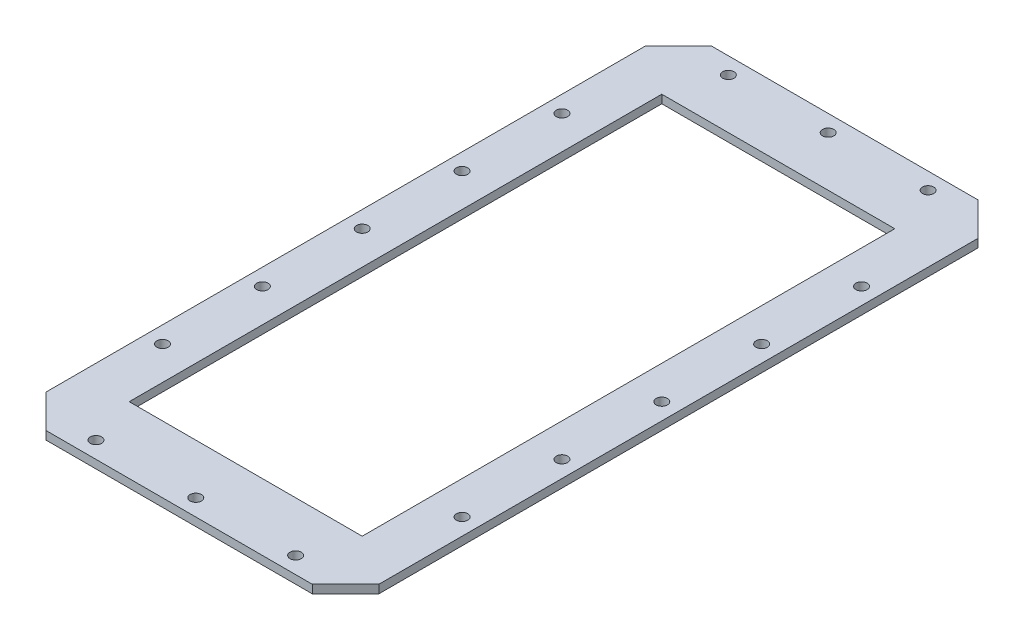
ISO-10303-21;
HEADER;
FILE_DESCRIPTION(('STEP AP214'),'2;1');
FILE_NAME('part.step','',(''),(''),'','','');
FILE_SCHEMA(('AUTOMOTIVE_DESIGN { 1 0 10303 214 1 1 1 1 }'));
ENDSEC;
DATA;
#1=APPLICATION_CONTEXT('core data for automotive mechanical design processes');
#2=APPLICATION_PROTOCOL_DEFINITION('international standard','automotive_design',2000,#1);
#3=PRODUCT_CONTEXT('',#1,'mechanical');
#4=PRODUCT('Part','Part','',(#3));
#5=PRODUCT_RELATED_PRODUCT_CATEGORY('part','',(#4));
#6=PRODUCT_DEFINITION_FORMATION('','',#4);
#7=PRODUCT_DEFINITION_CONTEXT('part definition',#1,'design');
#8=PRODUCT_DEFINITION('design','',#6,#7);
#9=PRODUCT_DEFINITION_SHAPE('','',#8);
#10=(LENGTH_UNIT() NAMED_UNIT(*) SI_UNIT(.MILLI.,.METRE.));
#11=(NAMED_UNIT(*) PLANE_ANGLE_UNIT() SI_UNIT($,.RADIAN.));
#12=(NAMED_UNIT(*) SI_UNIT($,.STERADIAN.) SOLID_ANGLE_UNIT());
#13=UNCERTAINTY_MEASURE_WITH_UNIT(LENGTH_MEASURE(1.E-05),#10,'distance_accuracy_value','');
#14=(GEOMETRIC_REPRESENTATION_CONTEXT(3) GLOBAL_UNCERTAINTY_ASSIGNED_CONTEXT((#13)) GLOBAL_UNIT_ASSIGNED_CONTEXT((#10,
#11,#12)) REPRESENTATION_CONTEXT('',''));
#15=CARTESIAN_POINT('',(0.,0.,0.));
#16=DIRECTION('',(0.,0.,1.));
#17=DIRECTION('',(1.,0.,0.));
#18=AXIS2_PLACEMENT_3D('',#15,#16,#17);
#19=CARTESIAN_POINT('',(0.,3.175,-228.6));
#20=DIRECTION('',(0.,0.,-1.));
#21=DIRECTION('',(-1.,0.,0.));
#22=AXIS2_PLACEMENT_3D('',#19,#20,#21);
#23=PLANE('',#22);
#24=DIRECTION('',(1.,0.,0.));
#25=VECTOR('',#24,1.);
#26=CARTESIAN_POINT('',(0.,0.,-228.6));
#27=LINE('',#26,#25);
#28=CARTESIAN_POINT('',(19.0499999999998,0.,-228.6));
#29=VERTEX_POINT('',#28);
#30=CARTESIAN_POINT('',(107.949999999999,0.,-228.6));
#31=VERTEX_POINT('',#30);
#32=EDGE_CURVE('E228',#29,#31,#27,.T.);
#33=ORIENTED_EDGE('',*,*,#32,.T.);
#34=DIRECTION('',(0.,-1.,0.));
#35=VECTOR('',#34,1.);
#36=CARTESIAN_POINT('',(107.949999999999,3.175,-228.6));
#37=LINE('',#36,#35);
#38=CARTESIAN_POINT('',(107.949999999999,3.175,-228.6));
#39=VERTEX_POINT('',#38);
#40=EDGE_CURVE('E11',#39,#31,#37,.T.);
#41=ORIENTED_EDGE('',*,*,#40,.F.);
#42=DIRECTION('',(1.,0.,0.));
#43=VECTOR('',#42,1.);
#44=CARTESIAN_POINT('',(0.,3.175,-228.6));
#45=LINE('',#44,#43);
#46=CARTESIAN_POINT('',(19.0499999999998,3.175,-228.6));
#47=VERTEX_POINT('',#46);
#48=EDGE_CURVE('E139',#47,#39,#45,.T.);
#49=ORIENTED_EDGE('',*,*,#48,.F.);
#50=DIRECTION('',(0.,-1.,0.));
#51=VECTOR('',#50,1.);
#52=CARTESIAN_POINT('',(19.0499999999998,3.175,-228.6));
#53=LINE('',#52,#51);
#54=EDGE_CURVE('E54',#47,#29,#53,.T.);
#55=ORIENTED_EDGE('',*,*,#54,.T.);
#56=EDGE_LOOP('',(#33,#41,#49,#55));
#57=FACE_BOUND('',#56,.T.);
#58=ADVANCED_FACE('F35',(#57),#23,.F.);
#59=CARTESIAN_POINT('',(107.949999999999,3.175,0.));
#60=DIRECTION('',(1.,0.,0.));
#61=DIRECTION('',(0.,0.,-1.));
#62=AXIS2_PLACEMENT_3D('',#59,#60,#61);
#63=PLANE('',#62);
#64=DIRECTION('',(0.,0.,1.));
#65=VECTOR('',#64,1.);
#66=CARTESIAN_POINT('',(107.949999999999,0.,0.));
#67=LINE('',#66,#65);
#68=CARTESIAN_POINT('',(107.949999999999,0.,-25.4000000000005));
#69=VERTEX_POINT('',#68);
#70=EDGE_CURVE('E145',#31,#69,#67,.T.);
#71=ORIENTED_EDGE('',*,*,#70,.T.);
#72=DIRECTION('',(0.,-1.,0.));
#73=VECTOR('',#72,1.);
#74=CARTESIAN_POINT('',(107.949999999999,3.175,-25.4000000000005));
#75=LINE('',#74,#73);
#76=CARTESIAN_POINT('',(107.949999999999,3.175,-25.4000000000005));
#77=VERTEX_POINT('',#76);
#78=EDGE_CURVE('E45',#77,#69,#75,.T.);
#79=ORIENTED_EDGE('',*,*,#78,.F.);
#80=DIRECTION('',(0.,0.,1.));
#81=VECTOR('',#80,1.);
#82=CARTESIAN_POINT('',(107.949999999999,3.175,0.));
#83=LINE('',#82,#81);
#84=EDGE_CURVE('E132',#39,#77,#83,.T.);
#85=ORIENTED_EDGE('',*,*,#84,.F.);
#86=ORIENTED_EDGE('',*,*,#40,.T.);
#87=EDGE_LOOP('',(#71,#79,#85,#86));
#88=FACE_BOUND('',#87,.T.);
#89=ADVANCED_FACE('F144',(#88),#63,.F.);
#90=CARTESIAN_POINT('',(0.,3.175,-25.4000000000005));
#91=DIRECTION('',(0.,0.,-1.));
#92=DIRECTION('',(-1.,0.,0.));
#93=AXIS2_PLACEMENT_3D('',#90,#91,#92);
#94=PLANE('',#93);
#95=DIRECTION('',(1.,0.,0.));
#96=VECTOR('',#95,1.);
#97=CARTESIAN_POINT('',(0.,0.,-25.4000000000005));
#98=LINE('',#97,#96);
#99=CARTESIAN_POINT('',(19.0499999999998,0.,-25.4000000000005));
#100=VERTEX_POINT('',#99);
#101=EDGE_CURVE('E231',#100,#69,#98,.T.);
#102=ORIENTED_EDGE('',*,*,#101,.F.);
#103=DIRECTION('',(0.,-1.,0.));
#104=VECTOR('',#103,1.);
#105=CARTESIAN_POINT('',(19.0499999999998,3.175,-25.4000000000005));
#106=LINE('',#105,#104);
#107=CARTESIAN_POINT('',(19.0499999999998,3.175,-25.4000000000005));
#108=VERTEX_POINT('',#107);
#109=EDGE_CURVE('E92',#108,#100,#106,.T.);
#110=ORIENTED_EDGE('',*,*,#109,.F.);
#111=DIRECTION('',(1.,0.,0.));
#112=VECTOR('',#111,1.);
#113=CARTESIAN_POINT('',(0.,3.175,-25.4000000000005));
#114=LINE('',#113,#112);
#115=EDGE_CURVE('E138',#108,#77,#114,.T.);
#116=ORIENTED_EDGE('',*,*,#115,.T.);
#117=ORIENTED_EDGE('',*,*,#78,.T.);
#118=EDGE_LOOP('',(#102,#110,#116,#117));
#119=FACE_BOUND('',#118,.T.);
#120=ADVANCED_FACE('F149',(#119),#94,.T.);
#121=CARTESIAN_POINT('',(6.34999999999973,3.175,-6.34999999999975));
#122=DIRECTION('',(-0.707106781186547,0.,0.707106781186548));
#123=DIRECTION('',(0.707106781186548,0.,0.707106781186547));
#124=AXIS2_PLACEMENT_3D('',#121,#122,#123);
#125=PLANE('',#124);
#126=DIRECTION('',(-0.707106781186548,0.,-0.707106781186547));
#127=VECTOR('',#126,1.);
#128=CARTESIAN_POINT('',(6.34999999999973,0.,-6.34999999999975));
#129=LINE('',#128,#127);
#130=CARTESIAN_POINT('',(12.6999999999995,0.,0.));
#131=VERTEX_POINT('',#130);
#132=CARTESIAN_POINT('',(-5.03348273414022E-13,0.,-12.7));
#133=VERTEX_POINT('',#132);
#134=EDGE_CURVE('E204',#131,#133,#129,.T.);
#135=ORIENTED_EDGE('',*,*,#134,.F.);
#136=DIRECTION('',(0.,-1.,0.));
#137=VECTOR('',#136,1.);
#138=CARTESIAN_POINT('',(12.6999999999995,3.175,0.));
#139=LINE('',#138,#137);
#140=CARTESIAN_POINT('',(12.6999999999995,3.175,0.));
#141=VERTEX_POINT('',#140);
#142=EDGE_CURVE('E39',#141,#131,#139,.T.);
#143=ORIENTED_EDGE('',*,*,#142,.F.);
#144=DIRECTION('',(-0.707106781186548,0.,-0.707106781186547));
#145=VECTOR('',#144,1.);
#146=CARTESIAN_POINT('',(6.34999999999973,3.175,-6.34999999999975));
#147=LINE('',#146,#145);
#148=CARTESIAN_POINT('',(-5.03348273414022E-13,3.175,-12.7));
#149=VERTEX_POINT('',#148);
#150=EDGE_CURVE('E310',#141,#149,#147,.T.);
#151=ORIENTED_EDGE('',*,*,#150,.T.);
#152=DIRECTION('',(0.,-1.,0.));
#153=VECTOR('',#152,1.);
#154=CARTESIAN_POINT('',(-5.03348273414022E-13,3.175,-12.7));
#155=LINE('',#154,#153);
#156=EDGE_CURVE('E170',#149,#133,#155,.T.);
#157=ORIENTED_EDGE('',*,*,#156,.T.);
#158=EDGE_LOOP('',(#135,#143,#151,#157));
#159=FACE_BOUND('',#158,.T.);
#160=ADVANCED_FACE('F274',(#159),#125,.T.);
#161=CARTESIAN_POINT('',(0.,3.175,0.));
#162=DIRECTION('',(0.,0.,1.));
#163=DIRECTION('',(1.,0.,0.));
#164=AXIS2_PLACEMENT_3D('',#161,#162,#163);
#165=PLANE('',#164);
#166=DIRECTION('',(-1.,0.,0.));
#167=VECTOR('',#166,1.);
#168=CARTESIAN_POINT('',(0.,0.,0.));
#169=LINE('',#168,#167);
#170=CARTESIAN_POINT('',(114.299999999999,0.,0.));
#171=VERTEX_POINT('',#170);
#172=EDGE_CURVE('E207',#171,#131,#169,.T.);
#173=ORIENTED_EDGE('',*,*,#172,.F.);
#174=DIRECTION('',(0.,-1.,0.));
#175=VECTOR('',#174,1.);
#176=CARTESIAN_POINT('',(114.299999999999,3.175,0.));
#177=LINE('',#176,#175);
#178=CARTESIAN_POINT('',(114.299999999999,3.175,0.));
#179=VERTEX_POINT('',#178);
#180=EDGE_CURVE('E264',#179,#171,#177,.T.);
#181=ORIENTED_EDGE('',*,*,#180,.F.);
#182=DIRECTION('',(-1.,0.,0.));
#183=VECTOR('',#182,1.);
#184=CARTESIAN_POINT('',(0.,3.175,0.));
#185=LINE('',#184,#183);
#186=EDGE_CURVE('E273',#179,#141,#185,.T.);
#187=ORIENTED_EDGE('',*,*,#186,.T.);
#188=ORIENTED_EDGE('',*,*,#142,.T.);
#189=EDGE_LOOP('',(#173,#181,#187,#188));
#190=FACE_BOUND('',#189,.T.);
#191=ADVANCED_FACE('F271',(#190),#165,.T.);
#192=CARTESIAN_POINT('',(57.1500000000001,3.175,57.1499999999997));
#193=DIRECTION('',(0.70710678118655,0.,0.707106781186545));
#194=DIRECTION('',(0.707106781186545,0.,-0.70710678118655));
#195=AXIS2_PLACEMENT_3D('',#192,#193,#194);
#196=PLANE('',#195);
#197=DIRECTION('',(-0.707106781186545,0.,0.70710678118655));
#198=VECTOR('',#197,1.);
#199=CARTESIAN_POINT('',(57.1500000000001,0.,57.1499999999997));
#200=LINE('',#199,#198);
#201=CARTESIAN_POINT('',(127.,0.,-12.7000000000002));
#202=VERTEX_POINT('',#201);
#203=EDGE_CURVE('E210',#202,#171,#200,.T.);
#204=ORIENTED_EDGE('',*,*,#203,.F.);
#205=DIRECTION('',(0.,-1.,0.));
#206=VECTOR('',#205,1.);
#207=CARTESIAN_POINT('',(127.,3.175,-12.7000000000002));
#208=LINE('',#207,#206);
#209=CARTESIAN_POINT('',(127.,3.175,-12.7000000000002));
#210=VERTEX_POINT('',#209);
#211=EDGE_CURVE('E263',#210,#202,#208,.T.);
#212=ORIENTED_EDGE('',*,*,#211,.F.);
#213=DIRECTION('',(-0.707106781186545,0.,0.70710678118655));
#214=VECTOR('',#213,1.);
#215=CARTESIAN_POINT('',(57.1500000000001,3.175,57.1499999999997));
#216=LINE('',#215,#214);
#217=EDGE_CURVE('E282',#210,#179,#216,.T.);
#218=ORIENTED_EDGE('',*,*,#217,.T.);
#219=ORIENTED_EDGE('',*,*,#180,.T.);
#220=EDGE_LOOP('',(#204,#212,#218,#219));
#221=FACE_BOUND('',#220,.T.);
#222=ADVANCED_FACE('F280',(#221),#196,.T.);
#223=CARTESIAN_POINT('',(127.,3.175,0.));
#224=DIRECTION('',(1.,0.,0.));
#225=DIRECTION('',(0.,0.,-1.));
#226=AXIS2_PLACEMENT_3D('',#223,#224,#225);
#227=PLANE('',#226);
#228=DIRECTION('',(0.,0.,1.));
#229=VECTOR('',#228,1.);
#230=CARTESIAN_POINT('',(127.,0.,0.));
#231=LINE('',#230,#229);
#232=CARTESIAN_POINT('',(127.,0.,-241.3));
#233=VERTEX_POINT('',#232);
#234=EDGE_CURVE('E213',#233,#202,#231,.T.);
#235=ORIENTED_EDGE('',*,*,#234,.F.);
#236=DIRECTION('',(0.,-1.,0.));
#237=VECTOR('',#236,1.);
#238=CARTESIAN_POINT('',(127.,3.175,-241.3));
#239=LINE('',#238,#237);
#240=CARTESIAN_POINT('',(127.,3.175,-241.3));
#241=VERTEX_POINT('',#240);
#242=EDGE_CURVE('E261',#241,#233,#239,.T.);
#243=ORIENTED_EDGE('',*,*,#242,.F.);
#244=DIRECTION('',(0.,0.,1.));
#245=VECTOR('',#244,1.);
#246=CARTESIAN_POINT('',(127.,3.175,0.));
#247=LINE('',#246,#245);
#248=EDGE_CURVE('E288',#241,#210,#247,.T.);
#249=ORIENTED_EDGE('',*,*,#248,.T.);
#250=ORIENTED_EDGE('',*,*,#211,.T.);
#251=EDGE_LOOP('',(#235,#243,#249,#250));
#252=FACE_BOUND('',#251,.T.);
#253=ADVANCED_FACE('F291',(#252),#227,.T.);
#254=CARTESIAN_POINT('',(184.149999999996,3.175,-184.150000000006));
#255=DIRECTION('',(0.707106781186529,0.,-0.707106781186566));
#256=DIRECTION('',(-0.707106781186566,0.,-0.707106781186529));
#257=AXIS2_PLACEMENT_3D('',#254,#255,#256);
#258=PLANE('',#257);
#259=DIRECTION('',(0.707106781186566,0.,0.707106781186529));
#260=VECTOR('',#259,1.);
#261=CARTESIAN_POINT('',(184.149999999996,0.,-184.150000000006));
#262=LINE('',#261,#260);
#263=CARTESIAN_POINT('',(114.299999999999,0.,-254.));
#264=VERTEX_POINT('',#263);
#265=EDGE_CURVE('E216',#264,#233,#262,.T.);
#266=ORIENTED_EDGE('',*,*,#265,.F.);
#267=DIRECTION('',(0.,-1.,0.));
#268=VECTOR('',#267,1.);
#269=CARTESIAN_POINT('',(114.299999999999,3.175,-254.));
#270=LINE('',#269,#268);
#271=CARTESIAN_POINT('',(114.299999999999,3.175,-254.));
#272=VERTEX_POINT('',#271);
#273=EDGE_CURVE('E259',#272,#264,#270,.T.);
#274=ORIENTED_EDGE('',*,*,#273,.F.);
#275=DIRECTION('',(0.707106781186566,0.,0.707106781186529));
#276=VECTOR('',#275,1.);
#277=CARTESIAN_POINT('',(184.149999999996,3.175,-184.150000000006));
#278=LINE('',#277,#276);
#279=EDGE_CURVE('E292',#272,#241,#278,.T.);
#280=ORIENTED_EDGE('',*,*,#279,.T.);
#281=ORIENTED_EDGE('',*,*,#242,.T.);
#282=EDGE_LOOP('',(#266,#274,#280,#281));
#283=FACE_BOUND('',#282,.T.);
#284=ADVANCED_FACE('F319',(#283),#258,.T.);
#285=CARTESIAN_POINT('',(0.,3.175,-254.));
#286=DIRECTION('',(0.,0.,-1.));
#287=DIRECTION('',(-1.,0.,0.));
#288=AXIS2_PLACEMENT_3D('',#285,#286,#287);
#289=PLANE('',#288);
#290=DIRECTION('',(1.,0.,0.));
#291=VECTOR('',#290,1.);
#292=CARTESIAN_POINT('',(0.,0.,-254.));
#293=LINE('',#292,#291);
#294=CARTESIAN_POINT('',(12.6999999999995,0.,-254.));
#295=VERTEX_POINT('',#294);
#296=EDGE_CURVE('E219',#295,#264,#293,.T.);
#297=ORIENTED_EDGE('',*,*,#296,.F.);
#298=DIRECTION('',(0.,-1.,0.));
#299=VECTOR('',#298,1.);
#300=CARTESIAN_POINT('',(12.6999999999995,3.175,-254.));
#301=LINE('',#300,#299);
#302=CARTESIAN_POINT('',(12.6999999999995,3.175,-254.));
#303=VERTEX_POINT('',#302);
#304=EDGE_CURVE('E257',#303,#295,#301,.T.);
#305=ORIENTED_EDGE('',*,*,#304,.F.);
#306=DIRECTION('',(1.,0.,0.));
#307=VECTOR('',#306,1.);
#308=CARTESIAN_POINT('',(0.,3.175,-254.));
#309=LINE('',#308,#307);
#310=EDGE_CURVE('E294',#303,#272,#309,.T.);
#311=ORIENTED_EDGE('',*,*,#310,.T.);
#312=ORIENTED_EDGE('',*,*,#273,.T.);
#313=EDGE_LOOP('',(#297,#305,#311,#312));
#314=FACE_BOUND('',#313,.T.);
#315=ADVANCED_FACE('F317',(#314),#289,.T.);
#316=CARTESIAN_POINT('',(-120.65,3.175,-120.650000000003));
#317=DIRECTION('',(-0.70710678118654,0.,-0.707106781186555));
#318=DIRECTION('',(-0.707106781186555,0.,0.70710678118654));
#319=AXIS2_PLACEMENT_3D('',#316,#317,#318);
#320=PLANE('',#319);
#321=DIRECTION('',(0.707106781186555,0.,-0.70710678118654));
#322=VECTOR('',#321,1.);
#323=CARTESIAN_POINT('',(-120.65,0.,-120.650000000003));
#324=LINE('',#323,#322);
#325=CARTESIAN_POINT('',(-5.00964118166406E-13,0.,-241.3));
#326=VERTEX_POINT('',#325);
#327=EDGE_CURVE('E222',#326,#295,#324,.T.);
#328=ORIENTED_EDGE('',*,*,#327,.F.);
#329=DIRECTION('',(0.,-1.,0.));
#330=VECTOR('',#329,1.);
#331=CARTESIAN_POINT('',(-5.00964118166406E-13,3.175,-241.3));
#332=LINE('',#331,#330);
#333=CARTESIAN_POINT('',(-5.00964118166406E-13,3.175,-241.3));
#334=VERTEX_POINT('',#333);
#335=EDGE_CURVE('E255',#334,#326,#332,.T.);
#336=ORIENTED_EDGE('',*,*,#335,.F.);
#337=DIRECTION('',(0.707106781186555,0.,-0.70710678118654));
#338=VECTOR('',#337,1.);
#339=CARTESIAN_POINT('',(-120.65,3.175,-120.650000000003));
#340=LINE('',#339,#338);
#341=EDGE_CURVE('E300',#334,#303,#340,.T.);
#342=ORIENTED_EDGE('',*,*,#341,.T.);
#343=ORIENTED_EDGE('',*,*,#304,.T.);
#344=EDGE_LOOP('',(#328,#336,#342,#343));
#345=FACE_BOUND('',#344,.T.);
#346=ADVANCED_FACE('F313',(#345),#320,.T.);
#347=CARTESIAN_POINT('',(120.649999999999,3.175,-88.9));
#348=DIRECTION('',(0.,-1.,0.));
#349=DIRECTION('',(0.,0.,-1.));
#350=AXIS2_PLACEMENT_3D('',#347,#348,#349);
#351=CYLINDRICAL_SURFACE('',#350,2.15899999999998);
#352=CARTESIAN_POINT('',(120.649999999999,3.175,-88.9));
#353=DIRECTION('',(0.,1.,0.));
#354=DIRECTION('',(0.,0.,1.));
#355=AXIS2_PLACEMENT_3D('',#352,#353,#354);
#356=CIRCLE('',#355,2.15899999999998);
#357=CARTESIAN_POINT('',(120.649999999999,3.175,-86.741));
#358=VERTEX_POINT('',#357);
#359=EDGE_CURVE('E164',#358,#358,#356,.T.);
#360=ORIENTED_EDGE('',*,*,#359,.T.);
#361=EDGE_LOOP('',(#360));
#362=FACE_BOUND('',#361,.T.);
#363=CARTESIAN_POINT('',(120.649999999999,0.,-88.9));
#364=DIRECTION('',(0.,1.,0.));
#365=DIRECTION('',(0.,0.,1.));
#366=AXIS2_PLACEMENT_3D('',#363,#364,#365);
#367=CIRCLE('',#366,2.15899999999998);
#368=CARTESIAN_POINT('',(120.649999999999,0.,-86.741));
#369=VERTEX_POINT('',#368);
#370=EDGE_CURVE('E245',#369,#369,#367,.T.);
#371=ORIENTED_EDGE('',*,*,#370,.F.);
#372=EDGE_LOOP('',(#371));
#373=FACE_BOUND('',#372,.T.);
#374=ADVANCED_FACE('F341',(#362,#373),#351,.F.);
#375=CARTESIAN_POINT('',(25.3999999999994,3.175,-6.3500000000003));
#376=DIRECTION('',(0.,-1.,0.));
#377=DIRECTION('',(0.,0.,-1.));
#378=AXIS2_PLACEMENT_3D('',#375,#376,#377);
#379=CYLINDRICAL_SURFACE('',#378,2.15899999999999);
#380=CARTESIAN_POINT('',(25.3999999999994,3.175,-6.3500000000003));
#381=DIRECTION('',(0.,1.,0.));
#382=DIRECTION('',(0.,0.,1.));
#383=AXIS2_PLACEMENT_3D('',#380,#381,#382);
#384=CIRCLE('',#383,2.15899999999999);
#385=CARTESIAN_POINT('',(25.3999999999994,3.175,-4.19100000000031));
#386=VERTEX_POINT('',#385);
#387=EDGE_CURVE('E161',#386,#386,#384,.F.);
#388=ORIENTED_EDGE('',*,*,#387,.F.);
#389=EDGE_LOOP('',(#388));
#390=FACE_BOUND('',#389,.T.);
#391=CARTESIAN_POINT('',(25.3999999999994,0.,-6.3500000000003));
#392=DIRECTION('',(0.,1.,0.));
#393=DIRECTION('',(0.,0.,1.));
#394=AXIS2_PLACEMENT_3D('',#391,#392,#393);
#395=CIRCLE('',#394,2.15899999999999);
#396=CARTESIAN_POINT('',(25.3999999999994,0.,-4.19100000000031));
#397=VERTEX_POINT('',#396);
#398=EDGE_CURVE('E242',#397,#397,#395,.F.);
#399=ORIENTED_EDGE('',*,*,#398,.T.);
#400=EDGE_LOOP('',(#399));
#401=FACE_BOUND('',#400,.T.);
#402=ADVANCED_FACE('F345',(#390,#401),#379,.F.);
#403=CARTESIAN_POINT('',(101.599999999999,3.175,-247.65));
#404=DIRECTION('',(0.,-1.,0.));
#405=DIRECTION('',(0.,0.,-1.));
#406=AXIS2_PLACEMENT_3D('',#403,#404,#405);
#407=CYLINDRICAL_SURFACE('',#406,2.15899999999999);
#408=CARTESIAN_POINT('',(101.599999999999,3.175,-247.65));
#409=DIRECTION('',(0.,1.,0.));
#410=DIRECTION('',(0.,0.,1.));
#411=AXIS2_PLACEMENT_3D('',#408,#409,#410);
#412=CIRCLE('',#411,2.15899999999999);
#413=CARTESIAN_POINT('',(101.599999999999,3.175,-245.491));
#414=VERTEX_POINT('',#413);
#415=EDGE_CURVE('E158',#414,#414,#412,.F.);
#416=ORIENTED_EDGE('',*,*,#415,.F.);
#417=EDGE_LOOP('',(#416));
#418=FACE_BOUND('',#417,.T.);
#419=CARTESIAN_POINT('',(101.599999999999,0.,-247.65));
#420=DIRECTION('',(0.,1.,0.));
#421=DIRECTION('',(0.,0.,1.));
#422=AXIS2_PLACEMENT_3D('',#419,#420,#421);
#423=CIRCLE('',#422,2.15899999999999);
#424=CARTESIAN_POINT('',(101.599999999999,0.,-245.491));
#425=VERTEX_POINT('',#424);
#426=EDGE_CURVE('E239',#425,#425,#423,.F.);
#427=ORIENTED_EDGE('',*,*,#426,.T.);
#428=EDGE_LOOP('',(#427));
#429=FACE_BOUND('',#428,.T.);
#430=ADVANCED_FACE('F351',(#418,#429),#407,.F.);
#431=CARTESIAN_POINT('',(120.649999999999,3.175,-165.1));
#432=DIRECTION('',(0.,-1.,0.));
#433=DIRECTION('',(0.,0.,-1.));
#434=AXIS2_PLACEMENT_3D('',#431,#432,#433);
#435=CYLINDRICAL_SURFACE('',#434,2.15899999999998);
#436=CARTESIAN_POINT('',(120.649999999999,3.175,-165.1));
#437=DIRECTION('',(0.,1.,0.));
#438=DIRECTION('',(0.,0.,1.));
#439=AXIS2_PLACEMENT_3D('',#436,#437,#438);
#440=CIRCLE('',#439,2.15899999999998);
#441=CARTESIAN_POINT('',(120.649999999999,3.175,-162.941));
#442=VERTEX_POINT('',#441);
#443=EDGE_CURVE('E152',#442,#442,#440,.F.);
#444=ORIENTED_EDGE('',*,*,#443,.F.);
#445=EDGE_LOOP('',(#444));
#446=FACE_BOUND('',#445,.T.);
#447=CARTESIAN_POINT('',(120.649999999999,0.,-165.1));
#448=DIRECTION('',(0.,1.,0.));
#449=DIRECTION('',(0.,0.,1.));
#450=AXIS2_PLACEMENT_3D('',#447,#448,#449);
#451=CIRCLE('',#450,2.15899999999998);
#452=CARTESIAN_POINT('',(120.649999999999,0.,-162.941));
#453=VERTEX_POINT('',#452);
#454=EDGE_CURVE('E236',#453,#453,#451,.F.);
#455=ORIENTED_EDGE('',*,*,#454,.T.);
#456=EDGE_LOOP('',(#455));
#457=FACE_BOUND('',#456,.T.);
#458=ADVANCED_FACE('F361',(#446,#457),#435,.F.);
#459=CARTESIAN_POINT('',(19.0499999999998,3.175,0.));
#460=DIRECTION('',(1.,0.,0.));
#461=DIRECTION('',(0.,0.,-1.));
#462=AXIS2_PLACEMENT_3D('',#459,#460,#461);
#463=PLANE('',#462);
#464=DIRECTION('',(0.,0.,1.));
#465=VECTOR('',#464,1.);
#466=CARTESIAN_POINT('',(19.0499999999998,0.,0.));
#467=LINE('',#466,#465);
#468=EDGE_CURVE('E233',#29,#100,#467,.T.);
#469=ORIENTED_EDGE('',*,*,#468,.F.);
#470=ORIENTED_EDGE('',*,*,#54,.F.);
#471=DIRECTION('',(0.,0.,1.));
#472=VECTOR('',#471,1.);
#473=CARTESIAN_POINT('',(19.0499999999998,3.175,0.));
#474=LINE('',#473,#472);
#475=EDGE_CURVE('E150',#47,#108,#474,.T.);
#476=ORIENTED_EDGE('',*,*,#475,.T.);
#477=ORIENTED_EDGE('',*,*,#109,.T.);
#478=EDGE_LOOP('',(#469,#470,#476,#477));
#479=FACE_BOUND('',#478,.T.);
#480=ADVANCED_FACE('F339',(#479),#463,.T.);
#481=CARTESIAN_POINT('',(-5.03480726483334E-13,3.175,0.));
#482=DIRECTION('',(-1.,0.,0.));
#483=DIRECTION('',(0.,0.,1.));
#484=AXIS2_PLACEMENT_3D('',#481,#482,#483);
#485=PLANE('',#484);
#486=DIRECTION('',(0.,0.,-1.));
#487=VECTOR('',#486,1.);
#488=CARTESIAN_POINT('',(-5.03480726483334E-13,0.,0.));
#489=LINE('',#488,#487);
#490=EDGE_CURVE('E225',#133,#326,#489,.T.);
#491=ORIENTED_EDGE('',*,*,#490,.F.);
#492=ORIENTED_EDGE('',*,*,#156,.F.);
#493=DIRECTION('',(0.,0.,-1.));
#494=VECTOR('',#493,1.);
#495=CARTESIAN_POINT('',(-5.03480726483334E-13,3.175,0.));
#496=LINE('',#495,#494);
#497=EDGE_CURVE('E303',#149,#334,#496,.T.);
#498=ORIENTED_EDGE('',*,*,#497,.T.);
#499=ORIENTED_EDGE('',*,*,#335,.T.);
#500=EDGE_LOOP('',(#491,#492,#498,#499));
#501=FACE_BOUND('',#500,.T.);
#502=ADVANCED_FACE('F307',(#501),#485,.T.);
#503=CARTESIAN_POINT('',(6.35,3.175,-165.1));
#504=DIRECTION('',(0.,-1.,0.));
#505=DIRECTION('',(0.,0.,-1.));
#506=AXIS2_PLACEMENT_3D('',#503,#504,#505);
#507=CYLINDRICAL_SURFACE('',#506,2.15899999999999);
#508=CARTESIAN_POINT('',(6.35,3.175,-165.1));
#509=DIRECTION('',(0.,1.,0.));
#510=DIRECTION('',(0.,0.,1.));
#511=AXIS2_PLACEMENT_3D('',#508,#509,#510);
#512=CIRCLE('',#511,2.15899999999999);
#513=CARTESIAN_POINT('',(6.35,3.175,-162.941));
#514=VERTEX_POINT('',#513);
#515=EDGE_CURVE('E503',#514,#514,#512,.T.);
#516=ORIENTED_EDGE('',*,*,#515,.T.);
#517=EDGE_LOOP('',(#516));
#518=FACE_BOUND('',#517,.T.);
#519=CARTESIAN_POINT('',(6.35,0.,-165.1));
#520=DIRECTION('',(0.,1.,0.));
#521=DIRECTION('',(0.,0.,1.));
#522=AXIS2_PLACEMENT_3D('',#519,#520,#521);
#523=CIRCLE('',#522,2.15899999999999);
#524=CARTESIAN_POINT('',(6.35,0.,-162.941));
#525=VERTEX_POINT('',#524);
#526=EDGE_CURVE('E201',#525,#525,#523,.T.);
#527=ORIENTED_EDGE('',*,*,#526,.F.);
#528=EDGE_LOOP('',(#527));
#529=FACE_BOUND('',#528,.T.);
#530=ADVANCED_FACE('F338',(#518,#529),#507,.F.);
#531=CARTESIAN_POINT('',(25.3999999999994,3.175,-247.65));
#532=DIRECTION('',(0.,-1.,0.));
#533=DIRECTION('',(0.,0.,-1.));
#534=AXIS2_PLACEMENT_3D('',#531,#532,#533);
#535=CYLINDRICAL_SURFACE('',#534,2.15900000000006);
#536=CARTESIAN_POINT('',(25.3999999999994,3.175,-247.65));
#537=DIRECTION('',(0.,1.,0.));
#538=DIRECTION('',(0.,0.,1.));
#539=AXIS2_PLACEMENT_3D('',#536,#537,#538);
#540=CIRCLE('',#539,2.15900000000006);
#541=CARTESIAN_POINT('',(25.3999999999994,3.175,-245.491));
#542=VERTEX_POINT('',#541);
#543=EDGE_CURVE('E500',#542,#542,#540,.T.);
#544=ORIENTED_EDGE('',*,*,#543,.T.);
#545=EDGE_LOOP('',(#544));
#546=FACE_BOUND('',#545,.T.);
#547=CARTESIAN_POINT('',(25.3999999999994,0.,-247.65));
#548=DIRECTION('',(0.,1.,0.));
#549=DIRECTION('',(0.,0.,1.));
#550=AXIS2_PLACEMENT_3D('',#547,#548,#549);
#551=CIRCLE('',#550,2.15900000000006);
#552=CARTESIAN_POINT('',(25.3999999999994,0.,-245.491));
#553=VERTEX_POINT('',#552);
#554=EDGE_CURVE('E198',#553,#553,#551,.T.);
#555=ORIENTED_EDGE('',*,*,#554,.F.);
#556=EDGE_LOOP('',(#555));
#557=FACE_BOUND('',#556,.T.);
#558=ADVANCED_FACE('F380',(#546,#557),#535,.F.);
#559=CARTESIAN_POINT('',(6.35,3.175,-203.2));
#560=DIRECTION('',(0.,-1.,0.));
#561=DIRECTION('',(0.,0.,-1.));
#562=AXIS2_PLACEMENT_3D('',#559,#560,#561);
#563=CYLINDRICAL_SURFACE('',#562,2.159);
#564=CARTESIAN_POINT('',(6.35,3.175,-203.2));
#565=DIRECTION('',(0.,1.,0.));
#566=DIRECTION('',(0.,0.,1.));
#567=AXIS2_PLACEMENT_3D('',#564,#565,#566);
#568=CIRCLE('',#567,2.159);
#569=CARTESIAN_POINT('',(6.35,3.175,-201.041));
#570=VERTEX_POINT('',#569);
#571=EDGE_CURVE('E496',#570,#570,#568,.T.);
#572=ORIENTED_EDGE('',*,*,#571,.T.);
#573=EDGE_LOOP('',(#572));
#574=FACE_BOUND('',#573,.T.);
#575=CARTESIAN_POINT('',(6.35,0.,-203.2));
#576=DIRECTION('',(0.,1.,0.));
#577=DIRECTION('',(0.,0.,1.));
#578=AXIS2_PLACEMENT_3D('',#575,#576,#577);
#579=CIRCLE('',#578,2.159);
#580=CARTESIAN_POINT('',(6.35,0.,-201.041));
#581=VERTEX_POINT('',#580);
#582=EDGE_CURVE('E195',#581,#581,#579,.T.);
#583=ORIENTED_EDGE('',*,*,#582,.F.);
#584=EDGE_LOOP('',(#583));
#585=FACE_BOUND('',#584,.T.);
#586=ADVANCED_FACE('F384',(#574,#585),#563,.F.);
#587=CARTESIAN_POINT('',(63.4999999999994,3.175,-247.65));
#588=DIRECTION('',(0.,-1.,0.));
#589=DIRECTION('',(0.,0.,-1.));
#590=AXIS2_PLACEMENT_3D('',#587,#588,#589);
#591=CYLINDRICAL_SURFACE('',#590,2.15900000000003);
#592=CARTESIAN_POINT('',(63.4999999999994,3.175,-247.65));
#593=DIRECTION('',(0.,1.,0.));
#594=DIRECTION('',(0.,0.,1.));
#595=AXIS2_PLACEMENT_3D('',#592,#593,#594);
#596=CIRCLE('',#595,2.15900000000003);
#597=CARTESIAN_POINT('',(63.4999999999994,3.175,-245.491));
#598=VERTEX_POINT('',#597);
#599=EDGE_CURVE('E492',#598,#598,#596,.T.);
#600=ORIENTED_EDGE('',*,*,#599,.T.);
#601=EDGE_LOOP('',(#600));
#602=FACE_BOUND('',#601,.T.);
#603=CARTESIAN_POINT('',(63.4999999999994,0.,-247.65));
#604=DIRECTION('',(0.,1.,0.));
#605=DIRECTION('',(0.,0.,1.));
#606=AXIS2_PLACEMENT_3D('',#603,#604,#605);
#607=CIRCLE('',#606,2.15900000000003);
#608=CARTESIAN_POINT('',(63.4999999999994,0.,-245.491));
#609=VERTEX_POINT('',#608);
#610=EDGE_CURVE('E192',#609,#609,#607,.T.);
#611=ORIENTED_EDGE('',*,*,#610,.F.);
#612=EDGE_LOOP('',(#611));
#613=FACE_BOUND('',#612,.T.);
#614=ADVANCED_FACE('F388',(#602,#613),#591,.F.);
#615=CARTESIAN_POINT('',(6.35,3.175,-127.));
#616=DIRECTION('',(0.,-1.,0.));
#617=DIRECTION('',(0.,0.,-1.));
#618=AXIS2_PLACEMENT_3D('',#615,#616,#617);
#619=CYLINDRICAL_SURFACE('',#618,2.159);
#620=CARTESIAN_POINT('',(6.35,3.175,-127.));
#621=DIRECTION('',(0.,1.,0.));
#622=DIRECTION('',(0.,0.,1.));
#623=AXIS2_PLACEMENT_3D('',#620,#621,#622);
#624=CIRCLE('',#623,2.159);
#625=CARTESIAN_POINT('',(6.35,3.175,-124.841));
#626=VERTEX_POINT('',#625);
#627=EDGE_CURVE('E488',#626,#626,#624,.T.);
#628=ORIENTED_EDGE('',*,*,#627,.T.);
#629=EDGE_LOOP('',(#628));
#630=FACE_BOUND('',#629,.T.);
#631=CARTESIAN_POINT('',(6.35,0.,-127.));
#632=DIRECTION('',(0.,1.,0.));
#633=DIRECTION('',(0.,0.,1.));
#634=AXIS2_PLACEMENT_3D('',#631,#632,#633);
#635=CIRCLE('',#634,2.159);
#636=CARTESIAN_POINT('',(6.35,0.,-124.841));
#637=VERTEX_POINT('',#636);
#638=EDGE_CURVE('E189',#637,#637,#635,.T.);
#639=ORIENTED_EDGE('',*,*,#638,.F.);
#640=EDGE_LOOP('',(#639));
#641=FACE_BOUND('',#640,.T.);
#642=ADVANCED_FACE('F392',(#630,#641),#619,.F.);
#643=CARTESIAN_POINT('',(120.649999999999,3.175,-127.));
#644=DIRECTION('',(0.,-1.,0.));
#645=DIRECTION('',(0.,0.,-1.));
#646=AXIS2_PLACEMENT_3D('',#643,#644,#645);
#647=CYLINDRICAL_SURFACE('',#646,2.15899999999999);
#648=CARTESIAN_POINT('',(120.649999999999,3.175,-127.));
#649=DIRECTION('',(0.,1.,0.));
#650=DIRECTION('',(0.,0.,1.));
#651=AXIS2_PLACEMENT_3D('',#648,#649,#650);
#652=CIRCLE('',#651,2.15899999999999);
#653=CARTESIAN_POINT('',(120.649999999999,3.175,-124.841));
#654=VERTEX_POINT('',#653);
#655=EDGE_CURVE('E484',#654,#654,#652,.F.);
#656=ORIENTED_EDGE('',*,*,#655,.F.);
#657=EDGE_LOOP('',(#656));
#658=FACE_BOUND('',#657,.T.);
#659=CARTESIAN_POINT('',(120.649999999999,0.,-127.));
#660=DIRECTION('',(0.,1.,0.));
#661=DIRECTION('',(0.,0.,1.));
#662=AXIS2_PLACEMENT_3D('',#659,#660,#661);
#663=CIRCLE('',#662,2.15899999999999);
#664=CARTESIAN_POINT('',(120.649999999999,0.,-124.841));
#665=VERTEX_POINT('',#664);
#666=EDGE_CURVE('E186',#665,#665,#663,.F.);
#667=ORIENTED_EDGE('',*,*,#666,.T.);
#668=EDGE_LOOP('',(#667));
#669=FACE_BOUND('',#668,.T.);
#670=ADVANCED_FACE('F396',(#658,#669),#647,.F.);
#671=CARTESIAN_POINT('',(120.649999999999,3.175,-203.2));
#672=DIRECTION('',(0.,-1.,0.));
#673=DIRECTION('',(0.,0.,-1.));
#674=AXIS2_PLACEMENT_3D('',#671,#672,#673);
#675=CYLINDRICAL_SURFACE('',#674,2.15899999999999);
#676=CARTESIAN_POINT('',(120.649999999999,3.175,-203.2));
#677=DIRECTION('',(0.,1.,0.));
#678=DIRECTION('',(0.,0.,1.));
#679=AXIS2_PLACEMENT_3D('',#676,#677,#678);
#680=CIRCLE('',#679,2.15899999999999);
#681=CARTESIAN_POINT('',(120.649999999999,3.175,-201.041));
#682=VERTEX_POINT('',#681);
#683=EDGE_CURVE('E480',#682,#682,#680,.F.);
#684=ORIENTED_EDGE('',*,*,#683,.F.);
#685=EDGE_LOOP('',(#684));
#686=FACE_BOUND('',#685,.T.);
#687=CARTESIAN_POINT('',(120.649999999999,0.,-203.2));
#688=DIRECTION('',(0.,1.,0.));
#689=DIRECTION('',(0.,0.,1.));
#690=AXIS2_PLACEMENT_3D('',#687,#688,#689);
#691=CIRCLE('',#690,2.15899999999999);
#692=CARTESIAN_POINT('',(120.649999999999,0.,-201.041));
#693=VERTEX_POINT('',#692);
#694=EDGE_CURVE('E183',#693,#693,#691,.F.);
#695=ORIENTED_EDGE('',*,*,#694,.T.);
#696=EDGE_LOOP('',(#695));
#697=FACE_BOUND('',#696,.T.);
#698=ADVANCED_FACE('F400',(#686,#697),#675,.F.);
#699=CARTESIAN_POINT('',(101.599999999999,3.175,-6.35000000000033));
#700=DIRECTION('',(0.,-1.,0.));
#701=DIRECTION('',(0.,0.,-1.));
#702=AXIS2_PLACEMENT_3D('',#699,#700,#701);
#703=CYLINDRICAL_SURFACE('',#702,2.15899999999999);
#704=CARTESIAN_POINT('',(101.599999999999,3.175,-6.35000000000033));
#705=DIRECTION('',(0.,1.,0.));
#706=DIRECTION('',(0.,0.,1.));
#707=AXIS2_PLACEMENT_3D('',#704,#705,#706);
#708=CIRCLE('',#707,2.15899999999999);
#709=CARTESIAN_POINT('',(101.599999999999,3.175,-4.19100000000033));
#710=VERTEX_POINT('',#709);
#711=EDGE_CURVE('E476',#710,#710,#708,.T.);
#712=ORIENTED_EDGE('',*,*,#711,.T.);
#713=EDGE_LOOP('',(#712));
#714=FACE_BOUND('',#713,.T.);
#715=CARTESIAN_POINT('',(101.599999999999,0.,-6.35000000000033));
#716=DIRECTION('',(0.,1.,0.));
#717=DIRECTION('',(0.,0.,1.));
#718=AXIS2_PLACEMENT_3D('',#715,#716,#717);
#719=CIRCLE('',#718,2.15899999999999);
#720=CARTESIAN_POINT('',(101.599999999999,0.,-4.19100000000033));
#721=VERTEX_POINT('',#720);
#722=EDGE_CURVE('E180',#721,#721,#719,.T.);
#723=ORIENTED_EDGE('',*,*,#722,.F.);
#724=EDGE_LOOP('',(#723));
#725=FACE_BOUND('',#724,.T.);
#726=ADVANCED_FACE('F404',(#714,#725),#703,.F.);
#727=CARTESIAN_POINT('',(63.4999999999994,3.175,-6.35000000000033));
#728=DIRECTION('',(0.,-1.,0.));
#729=DIRECTION('',(0.,0.,-1.));
#730=AXIS2_PLACEMENT_3D('',#727,#728,#729);
#731=CYLINDRICAL_SURFACE('',#730,2.15899999999999);
#732=CARTESIAN_POINT('',(63.4999999999994,3.175,-6.35000000000033));
#733=DIRECTION('',(0.,1.,0.));
#734=DIRECTION('',(0.,0.,1.));
#735=AXIS2_PLACEMENT_3D('',#732,#733,#734);
#736=CIRCLE('',#735,2.15899999999999);
#737=CARTESIAN_POINT('',(63.4999999999994,3.175,-4.19100000000033));
#738=VERTEX_POINT('',#737);
#739=EDGE_CURVE('E472',#738,#738,#736,.F.);
#740=ORIENTED_EDGE('',*,*,#739,.F.);
#741=EDGE_LOOP('',(#740));
#742=FACE_BOUND('',#741,.T.);
#743=CARTESIAN_POINT('',(63.4999999999994,0.,-6.35000000000033));
#744=DIRECTION('',(0.,1.,0.));
#745=DIRECTION('',(0.,0.,1.));
#746=AXIS2_PLACEMENT_3D('',#743,#744,#745);
#747=CIRCLE('',#746,2.15899999999999);
#748=CARTESIAN_POINT('',(63.4999999999994,0.,-4.19100000000033));
#749=VERTEX_POINT('',#748);
#750=EDGE_CURVE('E177',#749,#749,#747,.F.);
#751=ORIENTED_EDGE('',*,*,#750,.T.);
#752=EDGE_LOOP('',(#751));
#753=FACE_BOUND('',#752,.T.);
#754=ADVANCED_FACE('F408',(#742,#753),#731,.F.);
#755=CARTESIAN_POINT('',(120.649999999999,3.175,-50.8));
#756=DIRECTION('',(0.,-1.,0.));
#757=DIRECTION('',(0.,0.,-1.));
#758=AXIS2_PLACEMENT_3D('',#755,#756,#757);
#759=CYLINDRICAL_SURFACE('',#758,2.15899999999999);
#760=CARTESIAN_POINT('',(120.649999999999,3.175,-50.8));
#761=DIRECTION('',(0.,1.,0.));
#762=DIRECTION('',(0.,0.,1.));
#763=AXIS2_PLACEMENT_3D('',#760,#761,#762);
#764=CIRCLE('',#763,2.15899999999999);
#765=CARTESIAN_POINT('',(120.649999999999,3.175,-48.641));
#766=VERTEX_POINT('',#765);
#767=EDGE_CURVE('E422',#766,#766,#764,.T.);
#768=ORIENTED_EDGE('',*,*,#767,.T.);
#769=EDGE_LOOP('',(#768));
#770=FACE_BOUND('',#769,.T.);
#771=CARTESIAN_POINT('',(120.649999999999,0.,-50.8));
#772=DIRECTION('',(0.,1.,0.));
#773=DIRECTION('',(0.,0.,1.));
#774=AXIS2_PLACEMENT_3D('',#771,#772,#773);
#775=CIRCLE('',#774,2.15899999999999);
#776=CARTESIAN_POINT('',(120.649999999999,0.,-48.641));
#777=VERTEX_POINT('',#776);
#778=EDGE_CURVE('E174',#777,#777,#775,.T.);
#779=ORIENTED_EDGE('',*,*,#778,.F.);
#780=EDGE_LOOP('',(#779));
#781=FACE_BOUND('',#780,.T.);
#782=ADVANCED_FACE('F411',(#770,#781),#759,.F.);
#783=CARTESIAN_POINT('',(6.34999999999975,3.175,-50.8));
#784=DIRECTION('',(0.,-1.,0.));
#785=DIRECTION('',(0.,0.,-1.));
#786=AXIS2_PLACEMENT_3D('',#783,#784,#785);
#787=CYLINDRICAL_SURFACE('',#786,2.159);
#788=CARTESIAN_POINT('',(6.34999999999975,3.175,-50.8));
#789=DIRECTION('',(0.,1.,0.));
#790=DIRECTION('',(0.,0.,1.));
#791=AXIS2_PLACEMENT_3D('',#788,#789,#790);
#792=CIRCLE('',#791,2.159);
#793=CARTESIAN_POINT('',(6.34999999999975,3.175,-48.641));
#794=VERTEX_POINT('',#793);
#795=EDGE_CURVE('E251',#794,#794,#792,.F.);
#796=ORIENTED_EDGE('',*,*,#795,.F.);
#797=EDGE_LOOP('',(#796));
#798=FACE_BOUND('',#797,.T.);
#799=CARTESIAN_POINT('',(6.34999999999975,0.,-50.8));
#800=DIRECTION('',(0.,1.,0.));
#801=DIRECTION('',(0.,0.,1.));
#802=AXIS2_PLACEMENT_3D('',#799,#800,#801);
#803=CIRCLE('',#802,2.159);
#804=CARTESIAN_POINT('',(6.34999999999975,0.,-48.641));
#805=VERTEX_POINT('',#804);
#806=EDGE_CURVE('E171',#805,#805,#803,.F.);
#807=ORIENTED_EDGE('',*,*,#806,.T.);
#808=EDGE_LOOP('',(#807));
#809=FACE_BOUND('',#808,.T.);
#810=ADVANCED_FACE('F37',(#798,#809),#787,.F.);
#811=CARTESIAN_POINT('',(6.34999999999975,3.175,-88.9));
#812=DIRECTION('',(0.,-1.,0.));
#813=DIRECTION('',(0.,0.,-1.));
#814=AXIS2_PLACEMENT_3D('',#811,#812,#813);
#815=CYLINDRICAL_SURFACE('',#814,2.15899999999999);
#816=CARTESIAN_POINT('',(6.34999999999975,3.175,-88.9));
#817=DIRECTION('',(0.,1.,0.));
#818=DIRECTION('',(0.,0.,1.));
#819=AXIS2_PLACEMENT_3D('',#816,#817,#818);
#820=CIRCLE('',#819,2.15899999999999);
#821=CARTESIAN_POINT('',(6.34999999999975,3.175,-86.741));
#822=VERTEX_POINT('',#821);
#823=EDGE_CURVE('E167',#822,#822,#820,.F.);
#824=ORIENTED_EDGE('',*,*,#823,.F.);
#825=EDGE_LOOP('',(#824));
#826=FACE_BOUND('',#825,.T.);
#827=CARTESIAN_POINT('',(6.34999999999975,0.,-88.9));
#828=DIRECTION('',(0.,1.,0.));
#829=DIRECTION('',(0.,0.,1.));
#830=AXIS2_PLACEMENT_3D('',#827,#828,#829);
#831=CIRCLE('',#830,2.15899999999999);
#832=CARTESIAN_POINT('',(6.34999999999975,0.,-86.741));
#833=VERTEX_POINT('',#832);
#834=EDGE_CURVE('E248',#833,#833,#831,.F.);
#835=ORIENTED_EDGE('',*,*,#834,.T.);
#836=EDGE_LOOP('',(#835));
#837=FACE_BOUND('',#836,.T.);
#838=ADVANCED_FACE('F356',(#826,#837),#815,.F.);
#839=CARTESIAN_POINT('',(0.,3.175,0.));
#840=DIRECTION('',(0.,1.,0.));
#841=DIRECTION('',(0.,0.,1.));
#842=AXIS2_PLACEMENT_3D('',#839,#840,#841);
#843=PLANE('',#842);
#844=ORIENTED_EDGE('',*,*,#795,.T.);
#845=EDGE_LOOP('',(#844));
#846=FACE_BOUND('',#845,.T.);
#847=ORIENTED_EDGE('',*,*,#767,.F.);
#848=EDGE_LOOP('',(#847));
#849=FACE_BOUND('',#848,.T.);
#850=ORIENTED_EDGE('',*,*,#739,.T.);
#851=EDGE_LOOP('',(#850));
#852=FACE_BOUND('',#851,.T.);
#853=ORIENTED_EDGE('',*,*,#711,.F.);
#854=EDGE_LOOP('',(#853));
#855=FACE_BOUND('',#854,.T.);
#856=ORIENTED_EDGE('',*,*,#683,.T.);
#857=EDGE_LOOP('',(#856));
#858=FACE_BOUND('',#857,.T.);
#859=ORIENTED_EDGE('',*,*,#655,.T.);
#860=EDGE_LOOP('',(#859));
#861=FACE_BOUND('',#860,.T.);
#862=ORIENTED_EDGE('',*,*,#627,.F.);
#863=EDGE_LOOP('',(#862));
#864=FACE_BOUND('',#863,.T.);
#865=ORIENTED_EDGE('',*,*,#599,.F.);
#866=EDGE_LOOP('',(#865));
#867=FACE_BOUND('',#866,.T.);
#868=ORIENTED_EDGE('',*,*,#571,.F.);
#869=EDGE_LOOP('',(#868));
#870=FACE_BOUND('',#869,.T.);
#871=ORIENTED_EDGE('',*,*,#543,.F.);
#872=EDGE_LOOP('',(#871));
#873=FACE_BOUND('',#872,.T.);
#874=ORIENTED_EDGE('',*,*,#515,.F.);
#875=EDGE_LOOP('',(#874));
#876=FACE_BOUND('',#875,.T.);
#877=ORIENTED_EDGE('',*,*,#150,.F.);
#878=ORIENTED_EDGE('',*,*,#186,.F.);
#879=ORIENTED_EDGE('',*,*,#217,.F.);
#880=ORIENTED_EDGE('',*,*,#248,.F.);
#881=ORIENTED_EDGE('',*,*,#279,.F.);
#882=ORIENTED_EDGE('',*,*,#310,.F.);
#883=ORIENTED_EDGE('',*,*,#341,.F.);
#884=ORIENTED_EDGE('',*,*,#497,.F.);
#885=EDGE_LOOP('',(#877,#878,#879,#880,#881,#882,#883,#884));
#886=FACE_BOUND('',#885,.T.);
#887=ORIENTED_EDGE('',*,*,#48,.T.);
#888=ORIENTED_EDGE('',*,*,#84,.T.);
#889=ORIENTED_EDGE('',*,*,#115,.F.);
#890=ORIENTED_EDGE('',*,*,#475,.F.);
#891=EDGE_LOOP('',(#887,#888,#889,#890));
#892=FACE_BOUND('',#891,.T.);
#893=ORIENTED_EDGE('',*,*,#443,.T.);
#894=EDGE_LOOP('',(#893));
#895=FACE_BOUND('',#894,.T.);
#896=ORIENTED_EDGE('',*,*,#415,.T.);
#897=EDGE_LOOP('',(#896));
#898=FACE_BOUND('',#897,.T.);
#899=ORIENTED_EDGE('',*,*,#387,.T.);
#900=EDGE_LOOP('',(#899));
#901=FACE_BOUND('',#900,.T.);
#902=ORIENTED_EDGE('',*,*,#359,.F.);
#903=EDGE_LOOP('',(#902));
#904=FACE_BOUND('',#903,.T.);
#905=ORIENTED_EDGE('',*,*,#823,.T.);
#906=EDGE_LOOP('',(#905));
#907=FACE_BOUND('',#906,.T.);
#908=ADVANCED_FACE('F134',(#846,#849,#852,#855,#858,#861,#864,#867,#870,#873,#876,#886,#892,
#895,#898,#901,#904,#907),#843,.T.);
#909=CARTESIAN_POINT('',(0.,0.,0.));
#910=DIRECTION('',(0.,1.,0.));
#911=DIRECTION('',(0.,0.,1.));
#912=AXIS2_PLACEMENT_3D('',#909,#910,#911);
#913=PLANE('',#912);
#914=ORIENTED_EDGE('',*,*,#806,.F.);
#915=EDGE_LOOP('',(#914));
#916=FACE_BOUND('',#915,.T.);
#917=ORIENTED_EDGE('',*,*,#778,.T.);
#918=EDGE_LOOP('',(#917));
#919=FACE_BOUND('',#918,.T.);
#920=ORIENTED_EDGE('',*,*,#750,.F.);
#921=EDGE_LOOP('',(#920));
#922=FACE_BOUND('',#921,.T.);
#923=ORIENTED_EDGE('',*,*,#722,.T.);
#924=EDGE_LOOP('',(#923));
#925=FACE_BOUND('',#924,.T.);
#926=ORIENTED_EDGE('',*,*,#694,.F.);
#927=EDGE_LOOP('',(#926));
#928=FACE_BOUND('',#927,.T.);
#929=ORIENTED_EDGE('',*,*,#666,.F.);
#930=EDGE_LOOP('',(#929));
#931=FACE_BOUND('',#930,.T.);
#932=ORIENTED_EDGE('',*,*,#638,.T.);
#933=EDGE_LOOP('',(#932));
#934=FACE_BOUND('',#933,.T.);
#935=ORIENTED_EDGE('',*,*,#610,.T.);
#936=EDGE_LOOP('',(#935));
#937=FACE_BOUND('',#936,.T.);
#938=ORIENTED_EDGE('',*,*,#582,.T.);
#939=EDGE_LOOP('',(#938));
#940=FACE_BOUND('',#939,.T.);
#941=ORIENTED_EDGE('',*,*,#554,.T.);
#942=EDGE_LOOP('',(#941));
#943=FACE_BOUND('',#942,.T.);
#944=ORIENTED_EDGE('',*,*,#526,.T.);
#945=EDGE_LOOP('',(#944));
#946=FACE_BOUND('',#945,.T.);
#947=ORIENTED_EDGE('',*,*,#134,.T.);
#948=ORIENTED_EDGE('',*,*,#490,.T.);
#949=ORIENTED_EDGE('',*,*,#327,.T.);
#950=ORIENTED_EDGE('',*,*,#296,.T.);
#951=ORIENTED_EDGE('',*,*,#265,.T.);
#952=ORIENTED_EDGE('',*,*,#234,.T.);
#953=ORIENTED_EDGE('',*,*,#203,.T.);
#954=ORIENTED_EDGE('',*,*,#172,.T.);
#955=EDGE_LOOP('',(#947,#948,#949,#950,#951,#952,#953,#954));
#956=FACE_BOUND('',#955,.T.);
#957=ORIENTED_EDGE('',*,*,#32,.F.);
#958=ORIENTED_EDGE('',*,*,#468,.T.);
#959=ORIENTED_EDGE('',*,*,#101,.T.);
#960=ORIENTED_EDGE('',*,*,#70,.F.);
#961=EDGE_LOOP('',(#957,#958,#959,#960));
#962=FACE_BOUND('',#961,.T.);
#963=ORIENTED_EDGE('',*,*,#454,.F.);
#964=EDGE_LOOP('',(#963));
#965=FACE_BOUND('',#964,.T.);
#966=ORIENTED_EDGE('',*,*,#426,.F.);
#967=EDGE_LOOP('',(#966));
#968=FACE_BOUND('',#967,.T.);
#969=ORIENTED_EDGE('',*,*,#398,.F.);
#970=EDGE_LOOP('',(#969));
#971=FACE_BOUND('',#970,.T.);
#972=ORIENTED_EDGE('',*,*,#370,.T.);
#973=EDGE_LOOP('',(#972));
#974=FACE_BOUND('',#973,.T.);
#975=ORIENTED_EDGE('',*,*,#834,.F.);
#976=EDGE_LOOP('',(#975));
#977=FACE_BOUND('',#976,.T.);
#978=ADVANCED_FACE('F277',(#916,#919,#922,#925,#928,#931,#934,#937,#940,#943,#946,#956,#962,
#965,#968,#971,#974,#977),#913,.F.);
#979=CLOSED_SHELL('',(#58,#89,#120,#160,#191,#222,#253,#284,#315,#346,#374,#402,#430,#458,#480,
#502,#530,#558,#586,#614,#642,#670,#698,#726,#754,#782,#810,#838,#908,#978));
#980=MANIFOLD_SOLID_BREP('B2',#979);
#981=ADVANCED_BREP_SHAPE_REPRESENTATION('',(#18,#980),#14);
#982=SHAPE_DEFINITION_REPRESENTATION(#9,#981);
ENDSEC;
END-ISO-10303-21;
